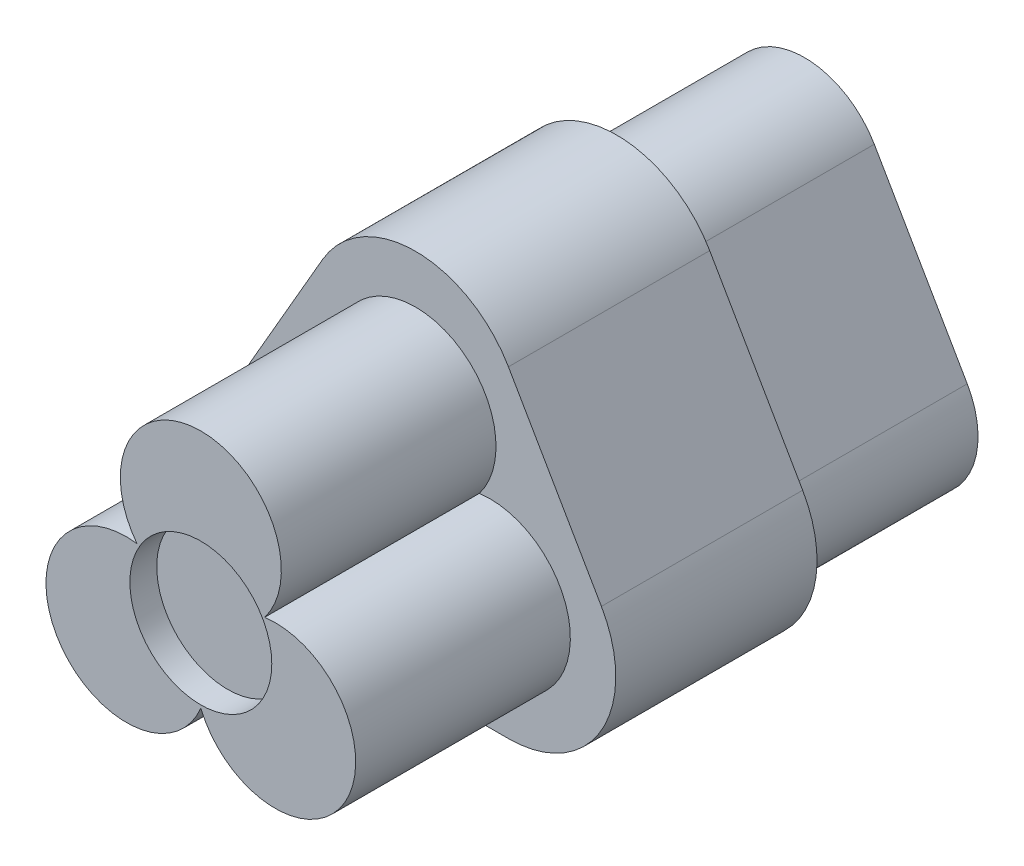
ISO-10303-21;
HEADER;
FILE_DESCRIPTION(('STEP AP214'),'2;1');
FILE_NAME('part.step','',(''),(''),'','','');
FILE_SCHEMA(('AUTOMOTIVE_DESIGN { 1 0 10303 214 1 1 1 1 }'));
ENDSEC;
DATA;
#1=APPLICATION_CONTEXT('core data for automotive mechanical design processes');
#2=APPLICATION_PROTOCOL_DEFINITION('international standard','automotive_design',2000,#1);
#3=PRODUCT_CONTEXT('',#1,'mechanical');
#4=PRODUCT('Part','Part','',(#3));
#5=PRODUCT_RELATED_PRODUCT_CATEGORY('part','',(#4));
#6=PRODUCT_DEFINITION_FORMATION('','',#4);
#7=PRODUCT_DEFINITION_CONTEXT('part definition',#1,'design');
#8=PRODUCT_DEFINITION('design','',#6,#7);
#9=PRODUCT_DEFINITION_SHAPE('','',#8);
#10=(LENGTH_UNIT() NAMED_UNIT(*) SI_UNIT(.MILLI.,.METRE.));
#11=(NAMED_UNIT(*) PLANE_ANGLE_UNIT() SI_UNIT($,.RADIAN.));
#12=(NAMED_UNIT(*) SI_UNIT($,.STERADIAN.) SOLID_ANGLE_UNIT());
#13=UNCERTAINTY_MEASURE_WITH_UNIT(LENGTH_MEASURE(1.E-05),#10,'distance_accuracy_value','');
#14=(GEOMETRIC_REPRESENTATION_CONTEXT(3) GLOBAL_UNCERTAINTY_ASSIGNED_CONTEXT((#13)) GLOBAL_UNIT_ASSIGNED_CONTEXT((#10,
#11,#12)) REPRESENTATION_CONTEXT('',''));
#15=CARTESIAN_POINT('',(0.,0.,0.));
#16=DIRECTION('',(0.,0.,1.));
#17=DIRECTION('',(1.,0.,0.));
#18=AXIS2_PLACEMENT_3D('',#15,#16,#17);
#19=CARTESIAN_POINT('',(3.46410161513783,-1.99999999999998,7.));
#20=DIRECTION('',(0.,0.,-1.));
#21=DIRECTION('',(-1.,0.,0.));
#22=AXIS2_PLACEMENT_3D('',#19,#20,#21);
#23=CYLINDRICAL_SURFACE('',#22,3.);
#24=CARTESIAN_POINT('',(3.46410161513783,-1.99999999999998,0.));
#25=DIRECTION('',(0.,0.,1.));
#26=DIRECTION('',(1.,0.,0.));
#27=AXIS2_PLACEMENT_3D('',#24,#25,#26);
#28=CIRCLE('',#27,3.);
#29=CARTESIAN_POINT('',(3.46410161513781,-4.99999999999998,0.));
#30=VERTEX_POINT('',#29);
#31=CARTESIAN_POINT('',(6.06217782649112,-0.499999999999928,0.));
#32=VERTEX_POINT('',#31);
#33=EDGE_CURVE('E134',#30,#32,#28,.T.);
#34=ORIENTED_EDGE('',*,*,#33,.T.);
#35=DIRECTION('',(0.,0.,-1.));
#36=VECTOR('',#35,1.);
#37=CARTESIAN_POINT('',(6.06217782649112,-0.499999999999928,7.));
#38=LINE('',#37,#36);
#39=CARTESIAN_POINT('',(6.06217782649112,-0.499999999999928,7.));
#40=VERTEX_POINT('',#39);
#41=EDGE_CURVE('E11',#40,#32,#38,.T.);
#42=ORIENTED_EDGE('',*,*,#41,.F.);
#43=CARTESIAN_POINT('',(3.46410161513783,-1.99999999999998,7.));
#44=DIRECTION('',(0.,0.,1.));
#45=DIRECTION('',(1.,0.,0.));
#46=AXIS2_PLACEMENT_3D('',#43,#44,#45);
#47=CIRCLE('',#46,3.);
#48=CARTESIAN_POINT('',(3.46410161513781,-4.99999999999998,7.));
#49=VERTEX_POINT('',#48);
#50=EDGE_CURVE('E126',#49,#40,#47,.T.);
#51=ORIENTED_EDGE('',*,*,#50,.F.);
#52=DIRECTION('',(0.,0.,-1.));
#53=VECTOR('',#52,1.);
#54=CARTESIAN_POINT('',(3.46410161513781,-4.99999999999998,7.));
#55=LINE('',#54,#53);
#56=EDGE_CURVE('E133',#49,#30,#55,.T.);
#57=ORIENTED_EDGE('',*,*,#56,.T.);
#58=EDGE_LOOP('',(#34,#42,#51,#57));
#59=FACE_BOUND('',#58,.T.);
#60=ADVANCED_FACE('F35',(#59),#23,.T.);
#61=CARTESIAN_POINT('',(6.06217782649112,-0.499999999999928,7.));
#62=DIRECTION('',(-0.866025403784436,-0.500000000000004,0.));
#63=DIRECTION('',(0.500000000000004,-0.866025403784436,0.));
#64=AXIS2_PLACEMENT_3D('',#61,#62,#63);
#65=PLANE('',#64);
#66=DIRECTION('',(-0.500000000000004,0.866025403784436,0.));
#67=VECTOR('',#66,1.);
#68=CARTESIAN_POINT('',(6.06217782649112,-0.499999999999928,0.));
#69=LINE('',#68,#67);
#70=CARTESIAN_POINT('',(2.59807621135335,5.50000000000003,0.));
#71=VERTEX_POINT('',#70);
#72=EDGE_CURVE('E137',#32,#71,#69,.T.);
#73=ORIENTED_EDGE('',*,*,#72,.T.);
#74=DIRECTION('',(0.,0.,-1.));
#75=VECTOR('',#74,1.);
#76=CARTESIAN_POINT('',(2.59807621135335,5.50000000000003,7.));
#77=LINE('',#76,#75);
#78=CARTESIAN_POINT('',(2.59807621135335,5.50000000000003,7.));
#79=VERTEX_POINT('',#78);
#80=EDGE_CURVE('E42',#79,#71,#77,.T.);
#81=ORIENTED_EDGE('',*,*,#80,.F.);
#82=DIRECTION('',(-0.500000000000004,0.866025403784436,0.));
#83=VECTOR('',#82,1.);
#84=CARTESIAN_POINT('',(6.06217782649112,-0.499999999999928,7.));
#85=LINE('',#84,#83);
#86=EDGE_CURVE('E93',#40,#79,#85,.T.);
#87=ORIENTED_EDGE('',*,*,#86,.F.);
#88=ORIENTED_EDGE('',*,*,#41,.T.);
#89=EDGE_LOOP('',(#73,#81,#87,#88));
#90=FACE_BOUND('',#89,.T.);
#91=ADVANCED_FACE('F339',(#90),#65,.F.);
#92=CARTESIAN_POINT('',(0.,4.00000000000005,7.));
#93=DIRECTION('',(0.,0.,-1.));
#94=DIRECTION('',(-1.,0.,0.));
#95=AXIS2_PLACEMENT_3D('',#92,#93,#94);
#96=CYLINDRICAL_SURFACE('',#95,3.);
#97=CARTESIAN_POINT('',(0.,4.00000000000005,0.));
#98=DIRECTION('',(0.,0.,1.));
#99=DIRECTION('',(1.,0.,0.));
#100=AXIS2_PLACEMENT_3D('',#97,#98,#99);
#101=CIRCLE('',#100,3.);
#102=CARTESIAN_POINT('',(-2.59807621135332,5.50000000000001,0.));
#103=VERTEX_POINT('',#102);
#104=EDGE_CURVE('E109',#71,#103,#101,.T.);
#105=ORIENTED_EDGE('',*,*,#104,.T.);
#106=DIRECTION('',(0.,0.,-1.));
#107=VECTOR('',#106,1.);
#108=CARTESIAN_POINT('',(-2.59807621135332,5.50000000000001,7.));
#109=LINE('',#108,#107);
#110=CARTESIAN_POINT('',(-2.59807621135332,5.50000000000001,7.));
#111=VERTEX_POINT('',#110);
#112=EDGE_CURVE('E102',#111,#103,#109,.T.);
#113=ORIENTED_EDGE('',*,*,#112,.F.);
#114=CARTESIAN_POINT('',(0.,4.00000000000005,7.));
#115=DIRECTION('',(0.,0.,1.));
#116=DIRECTION('',(1.,0.,0.));
#117=AXIS2_PLACEMENT_3D('',#114,#115,#116);
#118=CIRCLE('',#117,3.);
#119=EDGE_CURVE('E107',#79,#111,#118,.T.);
#120=ORIENTED_EDGE('',*,*,#119,.F.);
#121=ORIENTED_EDGE('',*,*,#80,.T.);
#122=EDGE_LOOP('',(#105,#113,#120,#121));
#123=FACE_BOUND('',#122,.T.);
#124=ADVANCED_FACE('F104',(#123),#96,.T.);
#125=CARTESIAN_POINT('',(-2.59807621135332,5.50000000000001,7.));
#126=DIRECTION('',(0.86602540378444,-0.499999999999998,0.));
#127=DIRECTION('',(0.499999999999998,0.86602540378444,0.));
#128=AXIS2_PLACEMENT_3D('',#125,#126,#127);
#129=PLANE('',#128);
#130=DIRECTION('',(-0.499999999999998,-0.86602540378444,0.));
#131=VECTOR('',#130,1.);
#132=CARTESIAN_POINT('',(-2.59807621135332,5.50000000000001,0.));
#133=LINE('',#132,#131);
#134=CARTESIAN_POINT('',(-6.06217782649106,-0.499999999999994,0.));
#135=VERTEX_POINT('',#134);
#136=EDGE_CURVE('E141',#103,#135,#133,.T.);
#137=ORIENTED_EDGE('',*,*,#136,.T.);
#138=DIRECTION('',(0.,0.,-1.));
#139=VECTOR('',#138,1.);
#140=CARTESIAN_POINT('',(-6.06217782649106,-0.499999999999994,7.));
#141=LINE('',#140,#139);
#142=CARTESIAN_POINT('',(-6.06217782649106,-0.499999999999994,7.));
#143=VERTEX_POINT('',#142);
#144=EDGE_CURVE('E112',#143,#135,#141,.T.);
#145=ORIENTED_EDGE('',*,*,#144,.F.);
#146=DIRECTION('',(-0.499999999999998,-0.86602540378444,0.));
#147=VECTOR('',#146,1.);
#148=CARTESIAN_POINT('',(-2.59807621135332,5.50000000000001,7.));
#149=LINE('',#148,#147);
#150=EDGE_CURVE('E115',#111,#143,#149,.T.);
#151=ORIENTED_EDGE('',*,*,#150,.F.);
#152=ORIENTED_EDGE('',*,*,#112,.T.);
#153=EDGE_LOOP('',(#137,#145,#151,#152));
#154=FACE_BOUND('',#153,.T.);
#155=ADVANCED_FACE('F116',(#154),#129,.F.);
#156=CARTESIAN_POINT('',(-3.46410161513776,-2.00000000000002,7.));
#157=DIRECTION('',(0.,0.,-1.));
#158=DIRECTION('',(-1.,0.,0.));
#159=AXIS2_PLACEMENT_3D('',#156,#157,#158);
#160=CYLINDRICAL_SURFACE('',#159,3.);
#161=CARTESIAN_POINT('',(-3.46410161513776,-2.00000000000002,0.));
#162=DIRECTION('',(0.,0.,1.));
#163=DIRECTION('',(1.,0.,0.));
#164=AXIS2_PLACEMENT_3D('',#161,#162,#163);
#165=CIRCLE('',#164,3.);
#166=CARTESIAN_POINT('',(-3.4641016151377,-5.00000000000002,0.));
#167=VERTEX_POINT('',#166);
#168=EDGE_CURVE('E143',#135,#167,#165,.T.);
#169=ORIENTED_EDGE('',*,*,#168,.T.);
#170=DIRECTION('',(0.,0.,-1.));
#171=VECTOR('',#170,1.);
#172=CARTESIAN_POINT('',(-3.4641016151377,-5.00000000000002,7.));
#173=LINE('',#172,#171);
#174=CARTESIAN_POINT('',(-3.4641016151377,-5.00000000000002,7.));
#175=VERTEX_POINT('',#174);
#176=EDGE_CURVE('E58',#175,#167,#173,.T.);
#177=ORIENTED_EDGE('',*,*,#176,.F.);
#178=CARTESIAN_POINT('',(-3.46410161513776,-2.00000000000002,7.));
#179=DIRECTION('',(0.,0.,1.));
#180=DIRECTION('',(1.,0.,0.));
#181=AXIS2_PLACEMENT_3D('',#178,#179,#180);
#182=CIRCLE('',#181,3.);
#183=EDGE_CURVE('E120',#143,#175,#182,.T.);
#184=ORIENTED_EDGE('',*,*,#183,.F.);
#185=ORIENTED_EDGE('',*,*,#144,.T.);
#186=EDGE_LOOP('',(#169,#177,#184,#185));
#187=FACE_BOUND('',#186,.T.);
#188=ADVANCED_FACE('F152',(#187),#160,.T.);
#189=CARTESIAN_POINT('',(-3.4641016151377,-5.00000000000002,7.));
#190=DIRECTION('',(0.,1.,0.));
#191=DIRECTION('',(-1.,0.,0.));
#192=AXIS2_PLACEMENT_3D('',#189,#190,#191);
#193=PLANE('',#192);
#194=DIRECTION('',(1.,0.,0.));
#195=VECTOR('',#194,1.);
#196=CARTESIAN_POINT('',(-3.4641016151377,-5.00000000000002,0.));
#197=LINE('',#196,#195);
#198=EDGE_CURVE('E85',#167,#30,#197,.T.);
#199=ORIENTED_EDGE('',*,*,#198,.T.);
#200=ORIENTED_EDGE('',*,*,#56,.F.);
#201=DIRECTION('',(1.,0.,0.));
#202=VECTOR('',#201,1.);
#203=CARTESIAN_POINT('',(-3.4641016151377,-5.00000000000002,7.));
#204=LINE('',#203,#202);
#205=EDGE_CURVE('E131',#175,#49,#204,.T.);
#206=ORIENTED_EDGE('',*,*,#205,.F.);
#207=ORIENTED_EDGE('',*,*,#176,.T.);
#208=EDGE_LOOP('',(#199,#200,#206,#207));
#209=FACE_BOUND('',#208,.T.);
#210=ADVANCED_FACE('F155',(#209),#193,.F.);
#211=CARTESIAN_POINT('',(3.46410161513783,-1.99999999999998,0.));
#212=DIRECTION('',(0.,0.,1.));
#213=DIRECTION('',(1.,0.,0.));
#214=AXIS2_PLACEMENT_3D('',#211,#212,#213);
#215=PLANE('',#214);
#216=ORIENTED_EDGE('',*,*,#33,.F.);
#217=ORIENTED_EDGE('',*,*,#198,.F.);
#218=ORIENTED_EDGE('',*,*,#168,.F.);
#219=ORIENTED_EDGE('',*,*,#136,.F.);
#220=ORIENTED_EDGE('',*,*,#104,.F.);
#221=ORIENTED_EDGE('',*,*,#72,.F.);
#222=EDGE_LOOP('',(#216,#217,#218,#219,#220,#221));
#223=FACE_BOUND('',#222,.T.);
#224=ADVANCED_FACE('F150',(#223),#215,.F.);
#225=CARTESIAN_POINT('',(3.46410161513783,-1.99999999999998,7.));
#226=DIRECTION('',(0.,0.,1.));
#227=DIRECTION('',(1.,0.,0.));
#228=AXIS2_PLACEMENT_3D('',#225,#226,#227);
#229=PLANE('',#228);
#230=CARTESIAN_POINT('',(3.46410161513783,-1.99999999999998,7.));
#231=DIRECTION('',(0.,0.,1.));
#232=DIRECTION('',(1.,0.,0.));
#233=AXIS2_PLACEMENT_3D('',#230,#231,#232);
#234=CIRCLE('',#233,4.);
#235=CARTESIAN_POINT('',(3.4641016151378,-5.99999999999998,7.));
#236=VERTEX_POINT('',#235);
#237=CARTESIAN_POINT('',(6.92820323027555,0.,7.));
#238=VERTEX_POINT('',#237);
#239=EDGE_CURVE('E192',#236,#238,#234,.T.);
#240=ORIENTED_EDGE('',*,*,#239,.F.);
#241=DIRECTION('',(1.,0.,0.));
#242=VECTOR('',#241,1.);
#243=CARTESIAN_POINT('',(-3.46410161513767,-6.00000000000002,7.));
#244=LINE('',#243,#242);
#245=CARTESIAN_POINT('',(-3.46410161513767,-6.00000000000002,7.));
#246=VERTEX_POINT('',#245);
#247=EDGE_CURVE('E176',#246,#236,#244,.T.);
#248=ORIENTED_EDGE('',*,*,#247,.F.);
#249=CARTESIAN_POINT('',(-3.46410161513776,-2.00000000000002,7.));
#250=DIRECTION('',(0.,0.,1.));
#251=DIRECTION('',(1.,0.,0.));
#252=AXIS2_PLACEMENT_3D('',#249,#250,#251);
#253=CIRCLE('',#252,4.);
#254=CARTESIAN_POINT('',(-6.9282032302755,0.,7.));
#255=VERTEX_POINT('',#254);
#256=EDGE_CURVE('E180',#255,#246,#253,.T.);
#257=ORIENTED_EDGE('',*,*,#256,.F.);
#258=DIRECTION('',(-0.499999999999998,-0.86602540378444,0.));
#259=VECTOR('',#258,1.);
#260=CARTESIAN_POINT('',(-3.46410161513777,6.,7.));
#261=LINE('',#260,#259);
#262=CARTESIAN_POINT('',(-3.46410161513777,6.,7.));
#263=VERTEX_POINT('',#262);
#264=EDGE_CURVE('E183',#263,#255,#261,.T.);
#265=ORIENTED_EDGE('',*,*,#264,.F.);
#266=CARTESIAN_POINT('',(0.,4.00000000000005,7.));
#267=DIRECTION('',(0.,0.,1.));
#268=DIRECTION('',(1.,0.,0.));
#269=AXIS2_PLACEMENT_3D('',#266,#267,#268);
#270=CIRCLE('',#269,4.);
#271=CARTESIAN_POINT('',(3.46410161513779,6.00000000000004,7.));
#272=VERTEX_POINT('',#271);
#273=EDGE_CURVE('E186',#272,#263,#270,.T.);
#274=ORIENTED_EDGE('',*,*,#273,.F.);
#275=DIRECTION('',(-0.500000000000004,0.866025403784436,0.));
#276=VECTOR('',#275,1.);
#277=CARTESIAN_POINT('',(6.92820323027555,0.,7.));
#278=LINE('',#277,#276);
#279=EDGE_CURVE('E189',#238,#272,#278,.T.);
#280=ORIENTED_EDGE('',*,*,#279,.F.);
#281=EDGE_LOOP('',(#240,#248,#257,#265,#274,#280));
#282=FACE_BOUND('',#281,.T.);
#283=ORIENTED_EDGE('',*,*,#205,.T.);
#284=ORIENTED_EDGE('',*,*,#50,.T.);
#285=ORIENTED_EDGE('',*,*,#86,.T.);
#286=ORIENTED_EDGE('',*,*,#119,.T.);
#287=ORIENTED_EDGE('',*,*,#150,.T.);
#288=ORIENTED_EDGE('',*,*,#183,.T.);
#289=EDGE_LOOP('',(#283,#284,#285,#286,#287,#288));
#290=FACE_BOUND('',#289,.T.);
#291=ADVANCED_FACE('F123',(#282,#290),#229,.F.);
#292=CARTESIAN_POINT('',(3.46410161513783,-1.99999999999998,14.5));
#293=DIRECTION('',(0.,0.,-1.));
#294=DIRECTION('',(-1.,0.,0.));
#295=AXIS2_PLACEMENT_3D('',#292,#293,#294);
#296=CYLINDRICAL_SURFACE('',#295,4.);
#297=ORIENTED_EDGE('',*,*,#239,.T.);
#298=DIRECTION('',(0.,0.,-1.));
#299=VECTOR('',#298,1.);
#300=CARTESIAN_POINT('',(6.92820323027555,0.,14.5));
#301=LINE('',#300,#299);
#302=CARTESIAN_POINT('',(6.92820323027555,0.,14.5));
#303=VERTEX_POINT('',#302);
#304=EDGE_CURVE('E138',#303,#238,#301,.T.);
#305=ORIENTED_EDGE('',*,*,#304,.F.);
#306=CARTESIAN_POINT('',(3.46410161513783,-1.99999999999998,14.5));
#307=DIRECTION('',(0.,0.,1.));
#308=DIRECTION('',(1.,0.,0.));
#309=AXIS2_PLACEMENT_3D('',#306,#307,#308);
#310=CIRCLE('',#309,4.);
#311=CARTESIAN_POINT('',(3.4641016151378,-5.99999999999998,14.5));
#312=VERTEX_POINT('',#311);
#313=EDGE_CURVE('E179',#312,#303,#310,.T.);
#314=ORIENTED_EDGE('',*,*,#313,.F.);
#315=DIRECTION('',(0.,0.,-1.));
#316=VECTOR('',#315,1.);
#317=CARTESIAN_POINT('',(3.4641016151378,-5.99999999999998,14.5));
#318=LINE('',#317,#316);
#319=EDGE_CURVE('E172',#312,#236,#318,.T.);
#320=ORIENTED_EDGE('',*,*,#319,.T.);
#321=EDGE_LOOP('',(#297,#305,#314,#320));
#322=FACE_BOUND('',#321,.T.);
#323=ADVANCED_FACE('F310',(#322),#296,.T.);
#324=CARTESIAN_POINT('',(6.92820323027555,0.,14.5));
#325=DIRECTION('',(-0.866025403784436,-0.500000000000004,0.));
#326=DIRECTION('',(0.500000000000004,-0.866025403784436,0.));
#327=AXIS2_PLACEMENT_3D('',#324,#325,#326);
#328=PLANE('',#327);
#329=ORIENTED_EDGE('',*,*,#279,.T.);
#330=DIRECTION('',(0.,0.,-1.));
#331=VECTOR('',#330,1.);
#332=CARTESIAN_POINT('',(3.46410161513779,6.00000000000004,14.5));
#333=LINE('',#332,#331);
#334=CARTESIAN_POINT('',(3.46410161513779,6.00000000000004,14.5));
#335=VERTEX_POINT('',#334);
#336=EDGE_CURVE('E160',#335,#272,#333,.T.);
#337=ORIENTED_EDGE('',*,*,#336,.F.);
#338=DIRECTION('',(-0.500000000000004,0.866025403784436,0.));
#339=VECTOR('',#338,1.);
#340=CARTESIAN_POINT('',(6.92820323027555,0.,14.5));
#341=LINE('',#340,#339);
#342=EDGE_CURVE('E207',#303,#335,#341,.T.);
#343=ORIENTED_EDGE('',*,*,#342,.F.);
#344=ORIENTED_EDGE('',*,*,#304,.T.);
#345=EDGE_LOOP('',(#329,#337,#343,#344));
#346=FACE_BOUND('',#345,.T.);
#347=ADVANCED_FACE('F316',(#346),#328,.F.);
#348=CARTESIAN_POINT('',(0.,4.00000000000005,14.5));
#349=DIRECTION('',(0.,0.,-1.));
#350=DIRECTION('',(-1.,0.,0.));
#351=AXIS2_PLACEMENT_3D('',#348,#349,#350);
#352=CYLINDRICAL_SURFACE('',#351,4.);
#353=ORIENTED_EDGE('',*,*,#273,.T.);
#354=DIRECTION('',(0.,0.,-1.));
#355=VECTOR('',#354,1.);
#356=CARTESIAN_POINT('',(-3.46410161513777,6.,14.5));
#357=LINE('',#356,#355);
#358=CARTESIAN_POINT('',(-3.46410161513777,6.,14.5));
#359=VERTEX_POINT('',#358);
#360=EDGE_CURVE('E163',#359,#263,#357,.T.);
#361=ORIENTED_EDGE('',*,*,#360,.F.);
#362=CARTESIAN_POINT('',(0.,4.00000000000005,14.5));
#363=DIRECTION('',(0.,0.,1.));
#364=DIRECTION('',(1.,0.,0.));
#365=AXIS2_PLACEMENT_3D('',#362,#363,#364);
#366=CIRCLE('',#365,4.);
#367=EDGE_CURVE('E204',#335,#359,#366,.T.);
#368=ORIENTED_EDGE('',*,*,#367,.F.);
#369=ORIENTED_EDGE('',*,*,#336,.T.);
#370=EDGE_LOOP('',(#353,#361,#368,#369));
#371=FACE_BOUND('',#370,.T.);
#372=ADVANCED_FACE('F329',(#371),#352,.T.);
#373=CARTESIAN_POINT('',(-3.46410161513777,6.,14.5));
#374=DIRECTION('',(0.86602540378444,-0.499999999999998,0.));
#375=DIRECTION('',(0.499999999999998,0.86602540378444,0.));
#376=AXIS2_PLACEMENT_3D('',#373,#374,#375);
#377=PLANE('',#376);
#378=ORIENTED_EDGE('',*,*,#264,.T.);
#379=DIRECTION('',(0.,0.,-1.));
#380=VECTOR('',#379,1.);
#381=CARTESIAN_POINT('',(-6.9282032302755,0.,14.5));
#382=LINE('',#381,#380);
#383=CARTESIAN_POINT('',(-6.9282032302755,0.,14.5));
#384=VERTEX_POINT('',#383);
#385=EDGE_CURVE('E166',#384,#255,#382,.T.);
#386=ORIENTED_EDGE('',*,*,#385,.F.);
#387=DIRECTION('',(-0.499999999999998,-0.86602540378444,0.));
#388=VECTOR('',#387,1.);
#389=CARTESIAN_POINT('',(-3.46410161513777,6.,14.5));
#390=LINE('',#389,#388);
#391=EDGE_CURVE('E201',#359,#384,#390,.T.);
#392=ORIENTED_EDGE('',*,*,#391,.F.);
#393=ORIENTED_EDGE('',*,*,#360,.T.);
#394=EDGE_LOOP('',(#378,#386,#392,#393));
#395=FACE_BOUND('',#394,.T.);
#396=ADVANCED_FACE('F326',(#395),#377,.F.);
#397=CARTESIAN_POINT('',(-3.46410161513776,-2.00000000000002,14.5));
#398=DIRECTION('',(0.,0.,-1.));
#399=DIRECTION('',(-1.,0.,0.));
#400=AXIS2_PLACEMENT_3D('',#397,#398,#399);
#401=CYLINDRICAL_SURFACE('',#400,4.);
#402=ORIENTED_EDGE('',*,*,#256,.T.);
#403=DIRECTION('',(0.,0.,-1.));
#404=VECTOR('',#403,1.);
#405=CARTESIAN_POINT('',(-3.46410161513767,-6.00000000000002,14.5));
#406=LINE('',#405,#404);
#407=CARTESIAN_POINT('',(-3.46410161513767,-6.00000000000002,14.5));
#408=VERTEX_POINT('',#407);
#409=EDGE_CURVE('E169',#408,#246,#406,.T.);
#410=ORIENTED_EDGE('',*,*,#409,.F.);
#411=CARTESIAN_POINT('',(-3.46410161513776,-2.00000000000002,14.5));
#412=DIRECTION('',(0.,0.,1.));
#413=DIRECTION('',(1.,0.,0.));
#414=AXIS2_PLACEMENT_3D('',#411,#412,#413);
#415=CIRCLE('',#414,4.);
#416=EDGE_CURVE('E198',#384,#408,#415,.T.);
#417=ORIENTED_EDGE('',*,*,#416,.F.);
#418=ORIENTED_EDGE('',*,*,#385,.T.);
#419=EDGE_LOOP('',(#402,#410,#417,#418));
#420=FACE_BOUND('',#419,.T.);
#421=ADVANCED_FACE('F324',(#420),#401,.T.);
#422=CARTESIAN_POINT('',(-3.46410161513767,-6.00000000000002,14.5));
#423=DIRECTION('',(0.,1.,0.));
#424=DIRECTION('',(-1.,0.,0.));
#425=AXIS2_PLACEMENT_3D('',#422,#423,#424);
#426=PLANE('',#425);
#427=ORIENTED_EDGE('',*,*,#247,.T.);
#428=ORIENTED_EDGE('',*,*,#319,.F.);
#429=DIRECTION('',(1.,0.,0.));
#430=VECTOR('',#429,1.);
#431=CARTESIAN_POINT('',(-3.46410161513767,-6.00000000000002,14.5));
#432=LINE('',#431,#430);
#433=EDGE_CURVE('E175',#408,#312,#432,.T.);
#434=ORIENTED_EDGE('',*,*,#433,.F.);
#435=ORIENTED_EDGE('',*,*,#409,.T.);
#436=EDGE_LOOP('',(#427,#428,#434,#435));
#437=FACE_BOUND('',#436,.T.);
#438=ADVANCED_FACE('F302',(#437),#426,.F.);
#439=CARTESIAN_POINT('',(3.46410161513783,-1.99999999999998,14.5));
#440=DIRECTION('',(0.,0.,1.));
#441=DIRECTION('',(1.,0.,0.));
#442=AXIS2_PLACEMENT_3D('',#439,#440,#441);
#443=PLANE('',#442);
#444=CARTESIAN_POINT('',(0.,3.2,14.5));
#445=DIRECTION('',(0.,0.,1.));
#446=DIRECTION('',(1.,0.,0.));
#447=AXIS2_PLACEMENT_3D('',#444,#445,#446);
#448=CIRCLE('',#447,3.);
#449=CARTESIAN_POINT('',(2.38062808316174,1.37445626465383,14.5));
#450=VERTEX_POINT('',#449);
#451=CARTESIAN_POINT('',(-2.38062808316171,1.37445626465379,14.5));
#452=VERTEX_POINT('',#451);
#453=EDGE_CURVE('E222',#450,#452,#448,.T.);
#454=ORIENTED_EDGE('',*,*,#453,.F.);
#455=CARTESIAN_POINT('',(2.77128129211022,-1.59999999999997,14.5));
#456=DIRECTION('',(0.,0.,1.));
#457=DIRECTION('',(1.,0.,0.));
#458=AXIS2_PLACEMENT_3D('',#455,#456,#457);
#459=CIRCLE('',#458,3.);
#460=CARTESIAN_POINT('',(0.,-2.74891252930759,14.5));
#461=VERTEX_POINT('',#460);
#462=EDGE_CURVE('E224',#461,#450,#459,.T.);
#463=ORIENTED_EDGE('',*,*,#462,.F.);
#464=CARTESIAN_POINT('',(-2.77128129211019,-1.60000000000002,14.5));
#465=DIRECTION('',(0.,0.,1.));
#466=DIRECTION('',(1.,0.,0.));
#467=AXIS2_PLACEMENT_3D('',#464,#465,#466);
#468=CIRCLE('',#467,3.);
#469=EDGE_CURVE('E219',#452,#461,#468,.T.);
#470=ORIENTED_EDGE('',*,*,#469,.F.);
#471=EDGE_LOOP('',(#454,#463,#470));
#472=FACE_BOUND('',#471,.T.);
#473=ORIENTED_EDGE('',*,*,#313,.T.);
#474=ORIENTED_EDGE('',*,*,#342,.T.);
#475=ORIENTED_EDGE('',*,*,#367,.T.);
#476=ORIENTED_EDGE('',*,*,#391,.T.);
#477=ORIENTED_EDGE('',*,*,#416,.T.);
#478=ORIENTED_EDGE('',*,*,#433,.T.);
#479=EDGE_LOOP('',(#473,#474,#475,#476,#477,#478));
#480=FACE_BOUND('',#479,.T.);
#481=ADVANCED_FACE('F319',(#472,#480),#443,.T.);
#482=CARTESIAN_POINT('',(2.77128129211022,-1.59999999999997,22.5));
#483=DIRECTION('',(0.,0.,-1.));
#484=DIRECTION('',(-1.,0.,0.));
#485=AXIS2_PLACEMENT_3D('',#482,#483,#484);
#486=CYLINDRICAL_SURFACE('',#485,3.);
#487=ORIENTED_EDGE('',*,*,#462,.T.);
#488=DIRECTION('',(0.,0.,-1.));
#489=VECTOR('',#488,1.);
#490=CARTESIAN_POINT('',(2.38062808316174,1.37445626465383,22.5));
#491=LINE('',#490,#489);
#492=CARTESIAN_POINT('',(2.38062808316174,1.37445626465383,22.5));
#493=VERTEX_POINT('',#492);
#494=EDGE_CURVE('E195',#493,#450,#491,.T.);
#495=ORIENTED_EDGE('',*,*,#494,.F.);
#496=CARTESIAN_POINT('',(2.77128129211022,-1.59999999999997,22.5));
#497=DIRECTION('',(0.,0.,1.));
#498=DIRECTION('',(1.,0.,0.));
#499=AXIS2_PLACEMENT_3D('',#496,#497,#498);
#500=CIRCLE('',#499,3.);
#501=CARTESIAN_POINT('',(0.,-2.74891252930759,22.5));
#502=VERTEX_POINT('',#501);
#503=EDGE_CURVE('E221',#502,#493,#500,.T.);
#504=ORIENTED_EDGE('',*,*,#503,.F.);
#505=DIRECTION('',(0.,0.,-1.));
#506=VECTOR('',#505,1.);
#507=CARTESIAN_POINT('',(0.,-2.74891252930759,22.5));
#508=LINE('',#507,#506);
#509=EDGE_CURVE('E215',#502,#461,#508,.T.);
#510=ORIENTED_EDGE('',*,*,#509,.T.);
#511=EDGE_LOOP('',(#487,#495,#504,#510));
#512=FACE_BOUND('',#511,.T.);
#513=ADVANCED_FACE('F264',(#512),#486,.T.);
#514=CARTESIAN_POINT('',(0.,3.2,22.5));
#515=DIRECTION('',(0.,0.,-1.));
#516=DIRECTION('',(-1.,0.,0.));
#517=AXIS2_PLACEMENT_3D('',#514,#515,#516);
#518=CYLINDRICAL_SURFACE('',#517,3.);
#519=ORIENTED_EDGE('',*,*,#453,.T.);
#520=DIRECTION('',(0.,0.,-1.));
#521=VECTOR('',#520,1.);
#522=CARTESIAN_POINT('',(-2.38062808316171,1.37445626465379,22.5));
#523=LINE('',#522,#521);
#524=CARTESIAN_POINT('',(-2.38062808316171,1.37445626465379,22.5));
#525=VERTEX_POINT('',#524);
#526=EDGE_CURVE('E49',#525,#452,#523,.T.);
#527=ORIENTED_EDGE('',*,*,#526,.F.);
#528=CARTESIAN_POINT('',(0.,3.2,22.5));
#529=DIRECTION('',(0.,0.,1.));
#530=DIRECTION('',(1.,0.,0.));
#531=AXIS2_PLACEMENT_3D('',#528,#529,#530);
#532=CIRCLE('',#531,3.);
#533=EDGE_CURVE('E230',#493,#525,#532,.T.);
#534=ORIENTED_EDGE('',*,*,#533,.F.);
#535=ORIENTED_EDGE('',*,*,#494,.T.);
#536=EDGE_LOOP('',(#519,#527,#534,#535));
#537=FACE_BOUND('',#536,.T.);
#538=ADVANCED_FACE('F269',(#537),#518,.T.);
#539=CARTESIAN_POINT('',(-2.77128129211019,-1.60000000000002,22.5));
#540=DIRECTION('',(0.,0.,-1.));
#541=DIRECTION('',(-1.,0.,0.));
#542=AXIS2_PLACEMENT_3D('',#539,#540,#541);
#543=CYLINDRICAL_SURFACE('',#542,3.);
#544=ORIENTED_EDGE('',*,*,#469,.T.);
#545=ORIENTED_EDGE('',*,*,#509,.F.);
#546=CARTESIAN_POINT('',(-2.77128129211019,-1.60000000000002,22.5));
#547=DIRECTION('',(0.,0.,1.));
#548=DIRECTION('',(1.,0.,0.));
#549=AXIS2_PLACEMENT_3D('',#546,#547,#548);
#550=CIRCLE('',#549,3.);
#551=EDGE_CURVE('E218',#525,#502,#550,.T.);
#552=ORIENTED_EDGE('',*,*,#551,.F.);
#553=ORIENTED_EDGE('',*,*,#526,.T.);
#554=EDGE_LOOP('',(#544,#545,#552,#553));
#555=FACE_BOUND('',#554,.T.);
#556=ADVANCED_FACE('F252',(#555),#543,.T.);
#557=CARTESIAN_POINT('',(1.38564064605511,0.800000000000014,22.5));
#558=DIRECTION('',(0.,0.,1.));
#559=DIRECTION('',(1.,0.,0.));
#560=AXIS2_PLACEMENT_3D('',#557,#558,#559);
#561=PLANE('',#560);
#562=CARTESIAN_POINT('',(0.,0.,22.5));
#563=DIRECTION('',(0.,0.,1.));
#564=DIRECTION('',(1.,0.,0.));
#565=AXIS2_PLACEMENT_3D('',#562,#563,#564);
#566=CIRCLE('',#565,2.64442453220167);
#567=CARTESIAN_POINT('',(2.64442453220167,0.,22.5));
#568=VERTEX_POINT('',#567);
#569=EDGE_CURVE('E235',#568,#568,#566,.T.);
#570=ORIENTED_EDGE('',*,*,#569,.F.);
#571=EDGE_LOOP('',(#570));
#572=FACE_BOUND('',#571,.T.);
#573=ORIENTED_EDGE('',*,*,#503,.T.);
#574=ORIENTED_EDGE('',*,*,#533,.T.);
#575=ORIENTED_EDGE('',*,*,#551,.T.);
#576=EDGE_LOOP('',(#573,#574,#575));
#577=FACE_BOUND('',#576,.T.);
#578=ADVANCED_FACE('F246',(#572,#577),#561,.T.);
#579=CARTESIAN_POINT('',(0.,0.,21.5));
#580=DIRECTION('',(0.,0.,1.));
#581=DIRECTION('',(1.,0.,0.));
#582=AXIS2_PLACEMENT_3D('',#579,#580,#581);
#583=CYLINDRICAL_SURFACE('',#582,2.64442453220167);
#584=CARTESIAN_POINT('',(0.,0.,21.5));
#585=DIRECTION('',(0.,0.,1.));
#586=DIRECTION('',(1.,0.,0.));
#587=AXIS2_PLACEMENT_3D('',#584,#585,#586);
#588=CIRCLE('',#587,2.64442453220167);
#589=CARTESIAN_POINT('',(2.64442453220167,0.,21.5));
#590=VERTEX_POINT('',#589);
#591=EDGE_CURVE('E227',#590,#590,#588,.T.);
#592=ORIENTED_EDGE('',*,*,#591,.F.);
#593=EDGE_LOOP('',(#592));
#594=FACE_BOUND('',#593,.T.);
#595=ORIENTED_EDGE('',*,*,#569,.T.);
#596=EDGE_LOOP('',(#595));
#597=FACE_BOUND('',#596,.T.);
#598=ADVANCED_FACE('F243',(#594,#597),#583,.F.);
#599=CARTESIAN_POINT('',(0.,0.,21.5));
#600=DIRECTION('',(0.,0.,1.));
#601=DIRECTION('',(1.,0.,0.));
#602=AXIS2_PLACEMENT_3D('',#599,#600,#601);
#603=PLANE('',#602);
#604=ORIENTED_EDGE('',*,*,#591,.T.);
#605=EDGE_LOOP('',(#604));
#606=FACE_BOUND('',#605,.T.);
#607=ADVANCED_FACE('F241',(#606),#603,.T.);
#608=CLOSED_SHELL('',(#60,#91,#124,#155,#188,#210,#224,#291,#323,#347,#372,#396,#421,#438,#481,
#513,#538,#556,#578,#598,#607));
#609=MANIFOLD_SOLID_BREP('B2',#608);
#610=ADVANCED_BREP_SHAPE_REPRESENTATION('',(#18,#609),#14);
#611=SHAPE_DEFINITION_REPRESENTATION(#9,#610);
ENDSEC;
END-ISO-10303-21;
